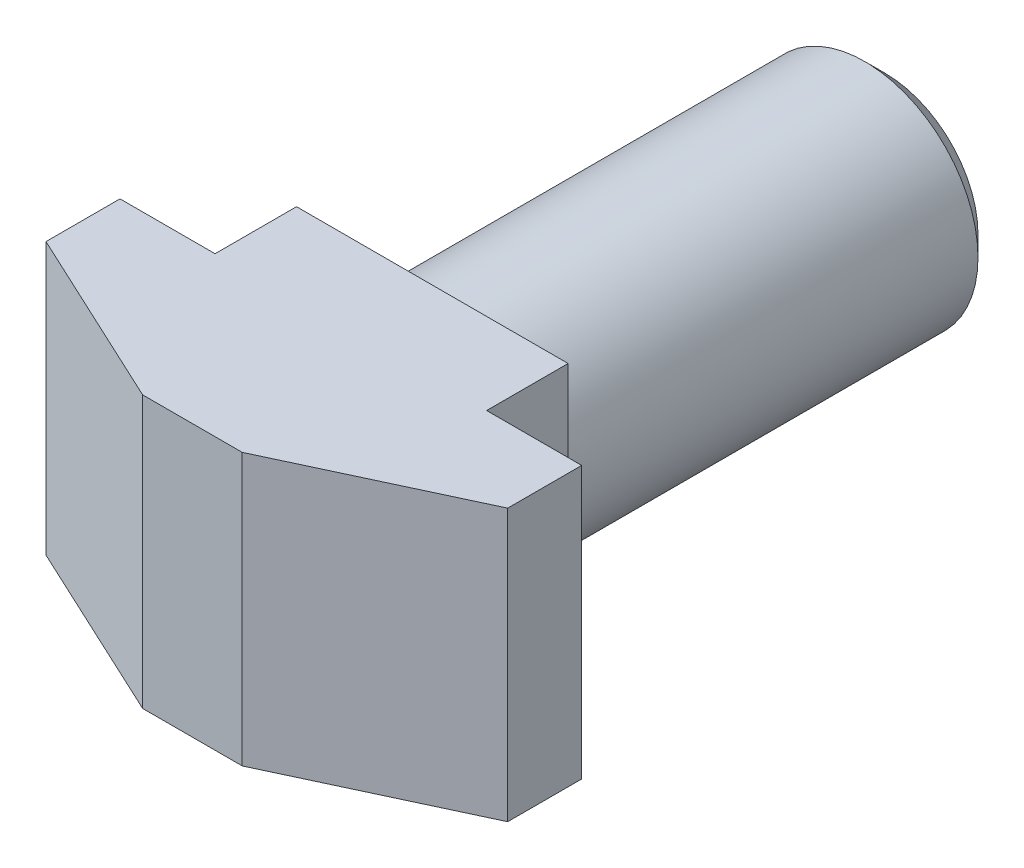
ISO-10303-21;
HEADER;
FILE_DESCRIPTION(('STEP AP214'),'2;1');
FILE_NAME('part.step','',(''),(''),'','','');
FILE_SCHEMA(('AUTOMOTIVE_DESIGN { 1 0 10303 214 1 1 1 1 }'));
ENDSEC;
DATA;
#1=APPLICATION_CONTEXT('core data for automotive mechanical design processes');
#2=APPLICATION_PROTOCOL_DEFINITION('international standard','automotive_design',2000,#1);
#3=PRODUCT_CONTEXT('',#1,'mechanical');
#4=PRODUCT('Part','Part','',(#3));
#5=PRODUCT_RELATED_PRODUCT_CATEGORY('part','',(#4));
#6=PRODUCT_DEFINITION_FORMATION('','',#4);
#7=PRODUCT_DEFINITION_CONTEXT('part definition',#1,'design');
#8=PRODUCT_DEFINITION('design','',#6,#7);
#9=PRODUCT_DEFINITION_SHAPE('','',#8);
#10=(LENGTH_UNIT() NAMED_UNIT(*) SI_UNIT(.MILLI.,.METRE.));
#11=(NAMED_UNIT(*) PLANE_ANGLE_UNIT() SI_UNIT($,.RADIAN.));
#12=(NAMED_UNIT(*) SI_UNIT($,.STERADIAN.) SOLID_ANGLE_UNIT());
#13=UNCERTAINTY_MEASURE_WITH_UNIT(LENGTH_MEASURE(1.E-05),#10,'distance_accuracy_value','');
#14=(GEOMETRIC_REPRESENTATION_CONTEXT(3) GLOBAL_UNCERTAINTY_ASSIGNED_CONTEXT((#13)) GLOBAL_UNIT_ASSIGNED_CONTEXT((#10,
#11,#12)) REPRESENTATION_CONTEXT('',''));
#15=CARTESIAN_POINT('',(0.,0.,0.));
#16=DIRECTION('',(0.,0.,1.));
#17=DIRECTION('',(1.,0.,0.));
#18=AXIS2_PLACEMENT_3D('',#15,#16,#17);
#19=CARTESIAN_POINT('',(10.2,6.,0.));
#20=DIRECTION('',(0.,0.,-1.));
#21=DIRECTION('',(-1.,0.,0.));
#22=AXIS2_PLACEMENT_3D('',#19,#20,#21);
#23=PLANE('',#22);
#24=DIRECTION('',(1.,0.,0.));
#25=VECTOR('',#24,1.);
#26=CARTESIAN_POINT('',(10.2,6.,0.));
#27=LINE('',#26,#25);
#28=CARTESIAN_POINT('',(4.00000000000003,6.,0.));
#29=VERTEX_POINT('',#28);
#30=CARTESIAN_POINT('',(6.19999999999997,6.,0.));
#31=VERTEX_POINT('',#30);
#32=EDGE_CURVE('E131',#29,#31,#27,.T.);
#33=ORIENTED_EDGE('',*,*,#32,.F.);
#34=DIRECTION('',(0.,-1.,0.));
#35=VECTOR('',#34,1.);
#36=CARTESIAN_POINT('',(4.00000000000003,6.,0.));
#37=LINE('',#36,#35);
#38=CARTESIAN_POINT('',(4.00000000000003,0.,0.));
#39=VERTEX_POINT('',#38);
#40=EDGE_CURVE('E190',#29,#39,#37,.T.);
#41=ORIENTED_EDGE('',*,*,#40,.T.);
#42=DIRECTION('',(1.,0.,0.));
#43=VECTOR('',#42,1.);
#44=CARTESIAN_POINT('',(10.2,0.,0.));
#45=LINE('',#44,#43);
#46=CARTESIAN_POINT('',(6.19999999999997,0.,0.));
#47=VERTEX_POINT('',#46);
#48=EDGE_CURVE('E160',#39,#47,#45,.T.);
#49=ORIENTED_EDGE('',*,*,#48,.T.);
#50=DIRECTION('',(0.,1.,0.));
#51=VECTOR('',#50,1.);
#52=CARTESIAN_POINT('',(6.19999999999997,6.,0.));
#53=LINE('',#52,#51);
#54=EDGE_CURVE('E140',#47,#31,#53,.T.);
#55=ORIENTED_EDGE('',*,*,#54,.T.);
#56=EDGE_LOOP('',(#33,#41,#49,#55));
#57=FACE_BOUND('',#56,.T.);
#58=ADVANCED_FACE('F45',(#57),#23,.F.);
#59=CARTESIAN_POINT('',(10.2,6.,-3.5));
#60=DIRECTION('',(-1.,0.,0.));
#61=DIRECTION('',(0.,0.,1.));
#62=AXIS2_PLACEMENT_3D('',#59,#60,#61);
#63=PLANE('',#62);
#64=DIRECTION('',(0.,0.,-1.));
#65=VECTOR('',#64,1.);
#66=CARTESIAN_POINT('',(10.2,6.,-3.5));
#67=LINE('',#66,#65);
#68=CARTESIAN_POINT('',(10.2,6.,-1.86523063262));
#69=VERTEX_POINT('',#68);
#70=CARTESIAN_POINT('',(10.2,6.,-3.5));
#71=VERTEX_POINT('',#70);
#72=EDGE_CURVE('E123',#69,#71,#67,.T.);
#73=ORIENTED_EDGE('',*,*,#72,.F.);
#74=DIRECTION('',(0.,-1.,0.));
#75=VECTOR('',#74,1.);
#76=CARTESIAN_POINT('',(10.2,6.,-1.86523063262));
#77=LINE('',#76,#75);
#78=CARTESIAN_POINT('',(10.2,0.,-1.86523063262));
#79=VERTEX_POINT('',#78);
#80=EDGE_CURVE('E11',#69,#79,#77,.T.);
#81=ORIENTED_EDGE('',*,*,#80,.T.);
#82=DIRECTION('',(0.,0.,-1.));
#83=VECTOR('',#82,1.);
#84=CARTESIAN_POINT('',(10.2,0.,-3.5));
#85=LINE('',#84,#83);
#86=CARTESIAN_POINT('',(10.2,0.,-3.5));
#87=VERTEX_POINT('',#86);
#88=EDGE_CURVE('E137',#79,#87,#85,.T.);
#89=ORIENTED_EDGE('',*,*,#88,.T.);
#90=DIRECTION('',(0.,-1.,0.));
#91=VECTOR('',#90,1.);
#92=CARTESIAN_POINT('',(10.2,6.,-3.5));
#93=LINE('',#92,#91);
#94=EDGE_CURVE('E134',#71,#87,#93,.T.);
#95=ORIENTED_EDGE('',*,*,#94,.F.);
#96=EDGE_LOOP('',(#73,#81,#89,#95));
#97=FACE_BOUND('',#96,.T.);
#98=ADVANCED_FACE('F135',(#97),#63,.F.);
#99=CARTESIAN_POINT('',(8.1,6.,-3.5));
#100=DIRECTION('',(0.,0.,1.));
#101=DIRECTION('',(1.,0.,0.));
#102=AXIS2_PLACEMENT_3D('',#99,#100,#101);
#103=PLANE('',#102);
#104=DIRECTION('',(-1.,0.,0.));
#105=VECTOR('',#104,1.);
#106=CARTESIAN_POINT('',(8.1,0.,-3.5));
#107=LINE('',#106,#105);
#108=CARTESIAN_POINT('',(8.1,0.,-3.5));
#109=VERTEX_POINT('',#108);
#110=EDGE_CURVE('E165',#87,#109,#107,.T.);
#111=ORIENTED_EDGE('',*,*,#110,.T.);
#112=DIRECTION('',(0.,-1.,0.));
#113=VECTOR('',#112,1.);
#114=CARTESIAN_POINT('',(8.1,6.,-3.5));
#115=LINE('',#114,#113);
#116=CARTESIAN_POINT('',(8.1,6.,-3.5));
#117=VERTEX_POINT('',#116);
#118=EDGE_CURVE('E141',#117,#109,#115,.T.);
#119=ORIENTED_EDGE('',*,*,#118,.F.);
#120=DIRECTION('',(-1.,0.,0.));
#121=VECTOR('',#120,1.);
#122=CARTESIAN_POINT('',(8.1,6.,-3.5));
#123=LINE('',#122,#121);
#124=EDGE_CURVE('E127',#71,#117,#123,.T.);
#125=ORIENTED_EDGE('',*,*,#124,.F.);
#126=ORIENTED_EDGE('',*,*,#94,.T.);
#127=EDGE_LOOP('',(#111,#119,#125,#126));
#128=FACE_BOUND('',#127,.T.);
#129=ADVANCED_FACE('F143',(#128),#103,.F.);
#130=CARTESIAN_POINT('',(8.1,6.,-5.3));
#131=DIRECTION('',(-1.,0.,0.));
#132=DIRECTION('',(0.,0.,1.));
#133=AXIS2_PLACEMENT_3D('',#130,#131,#132);
#134=PLANE('',#133);
#135=DIRECTION('',(0.,0.,-1.));
#136=VECTOR('',#135,1.);
#137=CARTESIAN_POINT('',(8.1,0.,-5.3));
#138=LINE('',#137,#136);
#139=CARTESIAN_POINT('',(8.1,0.,-5.3));
#140=VERTEX_POINT('',#139);
#141=EDGE_CURVE('E167',#109,#140,#138,.T.);
#142=ORIENTED_EDGE('',*,*,#141,.T.);
#143=DIRECTION('',(0.,-1.,0.));
#144=VECTOR('',#143,1.);
#145=CARTESIAN_POINT('',(8.1,6.,-5.3));
#146=LINE('',#145,#144);
#147=CARTESIAN_POINT('',(8.1,6.,-5.3));
#148=VERTEX_POINT('',#147);
#149=EDGE_CURVE('E185',#148,#140,#146,.T.);
#150=ORIENTED_EDGE('',*,*,#149,.F.);
#151=DIRECTION('',(0.,0.,-1.));
#152=VECTOR('',#151,1.);
#153=CARTESIAN_POINT('',(8.1,6.,-5.3));
#154=LINE('',#153,#152);
#155=EDGE_CURVE('E146',#117,#148,#154,.T.);
#156=ORIENTED_EDGE('',*,*,#155,.F.);
#157=ORIENTED_EDGE('',*,*,#118,.T.);
#158=EDGE_LOOP('',(#142,#150,#156,#157));
#159=FACE_BOUND('',#158,.T.);
#160=ADVANCED_FACE('F228',(#159),#134,.F.);
#161=CARTESIAN_POINT('',(2.1,6.,-5.3));
#162=DIRECTION('',(0.,0.,1.));
#163=DIRECTION('',(1.,0.,0.));
#164=AXIS2_PLACEMENT_3D('',#161,#162,#163);
#165=PLANE('',#164);
#166=CARTESIAN_POINT('',(5.1,3.,-5.3));
#167=DIRECTION('',(0.,0.,1.));
#168=DIRECTION('',(1.,0.,0.));
#169=AXIS2_PLACEMENT_3D('',#166,#167,#168);
#170=CIRCLE('',#169,2.5);
#171=CARTESIAN_POINT('',(7.6,3.,-5.3));
#172=VERTEX_POINT('',#171);
#173=EDGE_CURVE('E282',#172,#172,#170,.T.);
#174=ORIENTED_EDGE('',*,*,#173,.T.);
#175=EDGE_LOOP('',(#174));
#176=FACE_BOUND('',#175,.T.);
#177=DIRECTION('',(-1.,0.,0.));
#178=VECTOR('',#177,1.);
#179=CARTESIAN_POINT('',(2.1,0.,-5.3));
#180=LINE('',#179,#178);
#181=CARTESIAN_POINT('',(2.1,0.,-5.3));
#182=VERTEX_POINT('',#181);
#183=EDGE_CURVE('E169',#140,#182,#180,.T.);
#184=ORIENTED_EDGE('',*,*,#183,.T.);
#185=DIRECTION('',(0.,-1.,0.));
#186=VECTOR('',#185,1.);
#187=CARTESIAN_POINT('',(2.1,6.,-5.3));
#188=LINE('',#187,#186);
#189=CARTESIAN_POINT('',(2.1,6.,-5.3));
#190=VERTEX_POINT('',#189);
#191=EDGE_CURVE('E182',#190,#182,#188,.T.);
#192=ORIENTED_EDGE('',*,*,#191,.F.);
#193=DIRECTION('',(-1.,0.,0.));
#194=VECTOR('',#193,1.);
#195=CARTESIAN_POINT('',(2.1,6.,-5.3));
#196=LINE('',#195,#194);
#197=EDGE_CURVE('E148',#148,#190,#196,.T.);
#198=ORIENTED_EDGE('',*,*,#197,.F.);
#199=ORIENTED_EDGE('',*,*,#149,.T.);
#200=EDGE_LOOP('',(#184,#192,#198,#199));
#201=FACE_BOUND('',#200,.T.);
#202=ADVANCED_FACE('F225',(#176,#201),#165,.F.);
#203=CARTESIAN_POINT('',(2.1,6.,-3.5));
#204=DIRECTION('',(1.,0.,0.));
#205=DIRECTION('',(0.,0.,-1.));
#206=AXIS2_PLACEMENT_3D('',#203,#204,#205);
#207=PLANE('',#206);
#208=DIRECTION('',(0.,0.,1.));
#209=VECTOR('',#208,1.);
#210=CARTESIAN_POINT('',(2.1,0.,-3.5));
#211=LINE('',#210,#209);
#212=CARTESIAN_POINT('',(2.1,0.,-3.5));
#213=VERTEX_POINT('',#212);
#214=EDGE_CURVE('E171',#182,#213,#211,.T.);
#215=ORIENTED_EDGE('',*,*,#214,.T.);
#216=DIRECTION('',(0.,-1.,0.));
#217=VECTOR('',#216,1.);
#218=CARTESIAN_POINT('',(2.1,6.,-3.5));
#219=LINE('',#218,#217);
#220=CARTESIAN_POINT('',(2.1,6.,-3.5));
#221=VERTEX_POINT('',#220);
#222=EDGE_CURVE('E179',#221,#213,#219,.T.);
#223=ORIENTED_EDGE('',*,*,#222,.F.);
#224=DIRECTION('',(0.,0.,1.));
#225=VECTOR('',#224,1.);
#226=CARTESIAN_POINT('',(2.1,6.,-3.5));
#227=LINE('',#226,#225);
#228=EDGE_CURVE('E153',#190,#221,#227,.T.);
#229=ORIENTED_EDGE('',*,*,#228,.F.);
#230=ORIENTED_EDGE('',*,*,#191,.T.);
#231=EDGE_LOOP('',(#215,#223,#229,#230));
#232=FACE_BOUND('',#231,.T.);
#233=ADVANCED_FACE('F220',(#232),#207,.F.);
#234=CARTESIAN_POINT('',(0.,6.,-3.5));
#235=DIRECTION('',(0.,0.,1.));
#236=DIRECTION('',(1.,0.,0.));
#237=AXIS2_PLACEMENT_3D('',#234,#235,#236);
#238=PLANE('',#237);
#239=DIRECTION('',(-1.,0.,0.));
#240=VECTOR('',#239,1.);
#241=CARTESIAN_POINT('',(0.,0.,-3.5));
#242=LINE('',#241,#240);
#243=CARTESIAN_POINT('',(0.,0.,-3.5));
#244=VERTEX_POINT('',#243);
#245=EDGE_CURVE('E173',#213,#244,#242,.T.);
#246=ORIENTED_EDGE('',*,*,#245,.T.);
#247=DIRECTION('',(0.,-1.,0.));
#248=VECTOR('',#247,1.);
#249=CARTESIAN_POINT('',(0.,6.,-3.5));
#250=LINE('',#249,#248);
#251=CARTESIAN_POINT('',(0.,6.,-3.5));
#252=VERTEX_POINT('',#251);
#253=EDGE_CURVE('E159',#252,#244,#250,.T.);
#254=ORIENTED_EDGE('',*,*,#253,.F.);
#255=DIRECTION('',(-1.,0.,0.));
#256=VECTOR('',#255,1.);
#257=CARTESIAN_POINT('',(0.,6.,-3.5));
#258=LINE('',#257,#256);
#259=EDGE_CURVE('E155',#221,#252,#258,.T.);
#260=ORIENTED_EDGE('',*,*,#259,.F.);
#261=ORIENTED_EDGE('',*,*,#222,.T.);
#262=EDGE_LOOP('',(#246,#254,#260,#261));
#263=FACE_BOUND('',#262,.T.);
#264=ADVANCED_FACE('F214',(#263),#238,.F.);
#265=CARTESIAN_POINT('',(0.,6.,0.));
#266=DIRECTION('',(1.,0.,0.));
#267=DIRECTION('',(0.,0.,-1.));
#268=AXIS2_PLACEMENT_3D('',#265,#266,#267);
#269=PLANE('',#268);
#270=DIRECTION('',(0.,0.,1.));
#271=VECTOR('',#270,1.);
#272=CARTESIAN_POINT('',(0.,0.,0.));
#273=LINE('',#272,#271);
#274=CARTESIAN_POINT('',(0.,0.,-1.86523063262));
#275=VERTEX_POINT('',#274);
#276=EDGE_CURVE('E175',#244,#275,#273,.T.);
#277=ORIENTED_EDGE('',*,*,#276,.T.);
#278=DIRECTION('',(0.,1.,0.));
#279=VECTOR('',#278,1.);
#280=CARTESIAN_POINT('',(0.,6.,-1.86523063262));
#281=LINE('',#280,#279);
#282=CARTESIAN_POINT('',(0.,6.,-1.86523063262));
#283=VERTEX_POINT('',#282);
#284=EDGE_CURVE('E69',#275,#283,#281,.T.);
#285=ORIENTED_EDGE('',*,*,#284,.T.);
#286=DIRECTION('',(0.,0.,1.));
#287=VECTOR('',#286,1.);
#288=CARTESIAN_POINT('',(0.,6.,0.));
#289=LINE('',#288,#287);
#290=EDGE_CURVE('E157',#252,#283,#289,.T.);
#291=ORIENTED_EDGE('',*,*,#290,.F.);
#292=ORIENTED_EDGE('',*,*,#253,.T.);
#293=EDGE_LOOP('',(#277,#285,#291,#292));
#294=FACE_BOUND('',#293,.T.);
#295=ADVANCED_FACE('F210',(#294),#269,.F.);
#296=CARTESIAN_POINT('',(0.,6.,0.));
#297=DIRECTION('',(0.,-1.,0.));
#298=DIRECTION('',(0.,0.,-1.));
#299=AXIS2_PLACEMENT_3D('',#296,#297,#298);
#300=PLANE('',#299);
#301=ORIENTED_EDGE('',*,*,#290,.T.);
#302=DIRECTION('',(-0.906307787036651,0.,-0.422618261740697));
#303=VECTOR('',#302,1.);
#304=CARTESIAN_POINT('',(4.00000000000003,6.,0.));
#305=LINE('',#304,#303);
#306=EDGE_CURVE('E54',#283,#29,#305,.F.);
#307=ORIENTED_EDGE('',*,*,#306,.T.);
#308=ORIENTED_EDGE('',*,*,#32,.T.);
#309=DIRECTION('',(-0.906307787036651,0.,0.422618261740697));
#310=VECTOR('',#309,1.);
#311=CARTESIAN_POINT('',(10.2,6.,-1.86523063262));
#312=LINE('',#311,#310);
#313=EDGE_CURVE('E61',#31,#69,#312,.F.);
#314=ORIENTED_EDGE('',*,*,#313,.T.);
#315=ORIENTED_EDGE('',*,*,#72,.T.);
#316=ORIENTED_EDGE('',*,*,#124,.T.);
#317=ORIENTED_EDGE('',*,*,#155,.T.);
#318=ORIENTED_EDGE('',*,*,#197,.T.);
#319=ORIENTED_EDGE('',*,*,#228,.T.);
#320=ORIENTED_EDGE('',*,*,#259,.T.);
#321=EDGE_LOOP('',(#301,#307,#308,#314,#315,#316,#317,#318,#319,#320));
#322=FACE_BOUND('',#321,.T.);
#323=ADVANCED_FACE('F125',(#322),#300,.F.);
#324=CARTESIAN_POINT('',(0.,0.,0.));
#325=DIRECTION('',(0.,-1.,0.));
#326=DIRECTION('',(0.,0.,-1.));
#327=AXIS2_PLACEMENT_3D('',#324,#325,#326);
#328=PLANE('',#327);
#329=ORIENTED_EDGE('',*,*,#48,.F.);
#330=DIRECTION('',(0.906307787036651,0.,0.422618261740697));
#331=VECTOR('',#330,1.);
#332=CARTESIAN_POINT('',(0.714424780626919,0.,-1.53208888623796));
#333=LINE('',#332,#331);
#334=EDGE_CURVE('E195',#39,#275,#333,.F.);
#335=ORIENTED_EDGE('',*,*,#334,.T.);
#336=ORIENTED_EDGE('',*,*,#276,.F.);
#337=ORIENTED_EDGE('',*,*,#245,.F.);
#338=ORIENTED_EDGE('',*,*,#214,.F.);
#339=ORIENTED_EDGE('',*,*,#183,.F.);
#340=ORIENTED_EDGE('',*,*,#141,.F.);
#341=ORIENTED_EDGE('',*,*,#110,.F.);
#342=ORIENTED_EDGE('',*,*,#88,.F.);
#343=DIRECTION('',(0.906307787036651,0.,-0.422618261740697));
#344=VECTOR('',#343,1.);
#345=CARTESIAN_POINT('',(1.10735840997171,0.,2.37473777366881));
#346=LINE('',#345,#344);
#347=EDGE_CURVE('E193',#79,#47,#346,.F.);
#348=ORIENTED_EDGE('',*,*,#347,.T.);
#349=EDGE_LOOP('',(#329,#335,#336,#337,#338,#339,#340,#341,#342,#348));
#350=FACE_BOUND('',#349,.T.);
#351=ADVANCED_FACE('F208',(#350),#328,.T.);
#352=CARTESIAN_POINT('',(7.155,3.,-15.3));
#353=DIRECTION('',(0.,0.,-1.));
#354=DIRECTION('',(-1.,0.,0.));
#355=AXIS2_PLACEMENT_3D('',#352,#353,#354);
#356=PLANE('',#355);
#357=CARTESIAN_POINT('',(5.1,3.,-15.3));
#358=DIRECTION('',(0.,0.,1.));
#359=DIRECTION('',(1.,0.,0.));
#360=AXIS2_PLACEMENT_3D('',#357,#358,#359);
#361=CIRCLE('',#360,2.055);
#362=CARTESIAN_POINT('',(7.155,3.,-15.3));
#363=VERTEX_POINT('',#362);
#364=EDGE_CURVE('E163',#363,#363,#361,.T.);
#365=ORIENTED_EDGE('',*,*,#364,.F.);
#366=EDGE_LOOP('',(#365));
#367=FACE_BOUND('',#366,.T.);
#368=ADVANCED_FACE('F262',(#367),#356,.T.);
#369=CARTESIAN_POINT('',(5.1,3.,-14.855));
#370=DIRECTION('',(0.,0.,1.));
#371=DIRECTION('',(1.,0.,0.));
#372=AXIS2_PLACEMENT_3D('',#369,#370,#371);
#373=CONICAL_SURFACE('',#372,2.5,0.785398163397454);
#374=ORIENTED_EDGE('',*,*,#364,.T.);
#375=EDGE_LOOP('',(#374));
#376=FACE_BOUND('',#375,.T.);
#377=CARTESIAN_POINT('',(5.1,3.,-14.855));
#378=DIRECTION('',(0.,0.,1.));
#379=DIRECTION('',(1.,0.,0.));
#380=AXIS2_PLACEMENT_3D('',#377,#378,#379);
#381=CIRCLE('',#380,2.5);
#382=CARTESIAN_POINT('',(7.6,3.,-14.855));
#383=VERTEX_POINT('',#382);
#384=EDGE_CURVE('E279',#383,#383,#381,.T.);
#385=ORIENTED_EDGE('',*,*,#384,.F.);
#386=EDGE_LOOP('',(#385));
#387=FACE_BOUND('',#386,.T.);
#388=ADVANCED_FACE('F267',(#376,#387),#373,.T.);
#389=CARTESIAN_POINT('',(5.1,3.,-5.3));
#390=DIRECTION('',(0.,0.,1.));
#391=DIRECTION('',(1.,0.,0.));
#392=AXIS2_PLACEMENT_3D('',#389,#390,#391);
#393=CYLINDRICAL_SURFACE('',#392,2.5);
#394=ORIENTED_EDGE('',*,*,#384,.T.);
#395=EDGE_LOOP('',(#394));
#396=FACE_BOUND('',#395,.T.);
#397=ORIENTED_EDGE('',*,*,#173,.F.);
#398=EDGE_LOOP('',(#397));
#399=FACE_BOUND('',#398,.T.);
#400=ADVANCED_FACE('F234',(#396,#399),#393,.T.);
#401=CARTESIAN_POINT('',(4.00000000000003,6.,0.));
#402=DIRECTION('',(0.422618261740697,0.,-0.906307787036651));
#403=DIRECTION('',(0.,-1.,0.));
#404=AXIS2_PLACEMENT_3D('',#401,#402,#403);
#405=PLANE('',#404);
#406=ORIENTED_EDGE('',*,*,#306,.F.);
#407=ORIENTED_EDGE('',*,*,#284,.F.);
#408=ORIENTED_EDGE('',*,*,#334,.F.);
#409=ORIENTED_EDGE('',*,*,#40,.F.);
#410=EDGE_LOOP('',(#406,#407,#408,#409));
#411=FACE_BOUND('',#410,.T.);
#412=ADVANCED_FACE('F205',(#411),#405,.F.);
#413=CARTESIAN_POINT('',(10.2,6.,-1.86523063262));
#414=DIRECTION('',(-0.422618261740697,0.,-0.906307787036651));
#415=DIRECTION('',(0.,-1.,0.));
#416=AXIS2_PLACEMENT_3D('',#413,#414,#415);
#417=PLANE('',#416);
#418=ORIENTED_EDGE('',*,*,#313,.F.);
#419=ORIENTED_EDGE('',*,*,#54,.F.);
#420=ORIENTED_EDGE('',*,*,#347,.F.);
#421=ORIENTED_EDGE('',*,*,#80,.F.);
#422=EDGE_LOOP('',(#418,#419,#420,#421));
#423=FACE_BOUND('',#422,.T.);
#424=ADVANCED_FACE('F48',(#423),#417,.F.);
#425=CLOSED_SHELL('',(#58,#98,#129,#160,#202,#233,#264,#295,#323,#351,#368,#388,#400,#412,#424));
#426=MANIFOLD_SOLID_BREP('B2',#425);
#427=ADVANCED_BREP_SHAPE_REPRESENTATION('',(#18,#426),#14);
#428=SHAPE_DEFINITION_REPRESENTATION(#9,#427);
ENDSEC;
END-ISO-10303-21;
